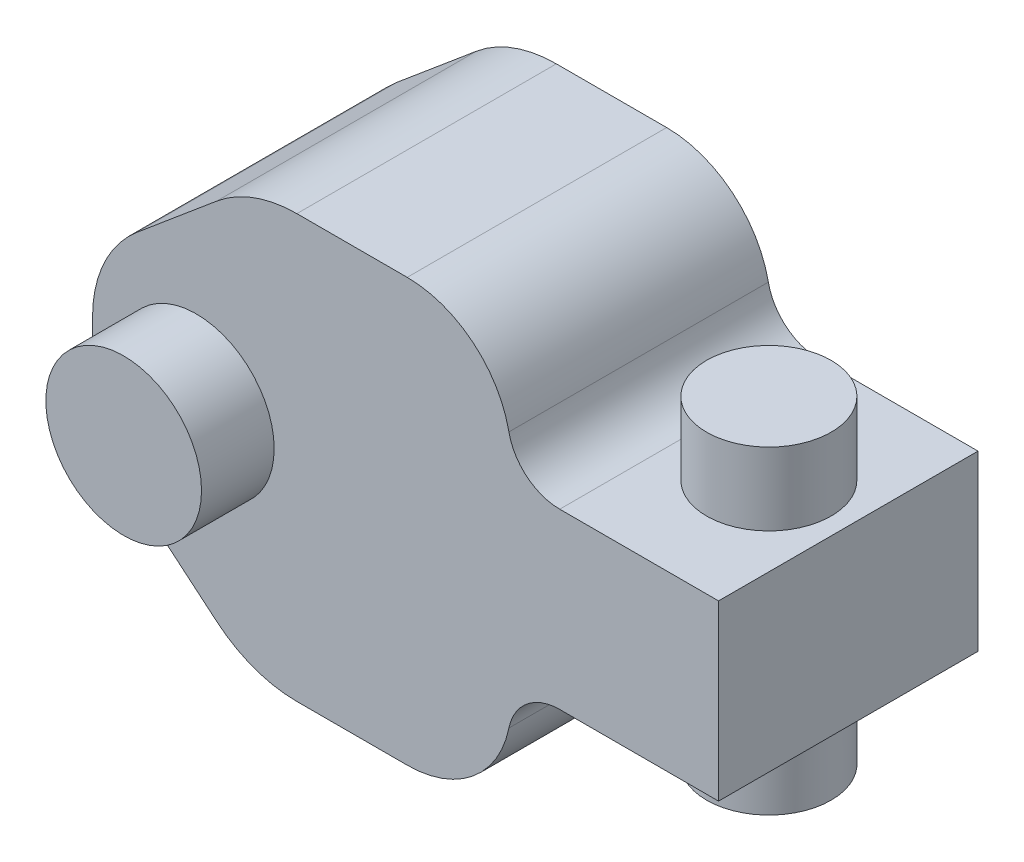
ISO-10303-21;
HEADER;
FILE_DESCRIPTION(('STEP AP214'),'2;1');
FILE_NAME('part.step','',(''),(''),'','','');
FILE_SCHEMA(('AUTOMOTIVE_DESIGN { 1 0 10303 214 1 1 1 1 }'));
ENDSEC;
DATA;
#1=APPLICATION_CONTEXT('core data for automotive mechanical design processes');
#2=APPLICATION_PROTOCOL_DEFINITION('international standard','automotive_design',2000,#1);
#3=PRODUCT_CONTEXT('',#1,'mechanical');
#4=PRODUCT('Part','Part','',(#3));
#5=PRODUCT_RELATED_PRODUCT_CATEGORY('part','',(#4));
#6=PRODUCT_DEFINITION_FORMATION('','',#4);
#7=PRODUCT_DEFINITION_CONTEXT('part definition',#1,'design');
#8=PRODUCT_DEFINITION('design','',#6,#7);
#9=PRODUCT_DEFINITION_SHAPE('','',#8);
#10=(LENGTH_UNIT() NAMED_UNIT(*) SI_UNIT(.MILLI.,.METRE.));
#11=(NAMED_UNIT(*) PLANE_ANGLE_UNIT() SI_UNIT($,.RADIAN.));
#12=(NAMED_UNIT(*) SI_UNIT($,.STERADIAN.) SOLID_ANGLE_UNIT());
#13=UNCERTAINTY_MEASURE_WITH_UNIT(LENGTH_MEASURE(1.E-05),#10,'distance_accuracy_value','');
#14=(GEOMETRIC_REPRESENTATION_CONTEXT(3) GLOBAL_UNCERTAINTY_ASSIGNED_CONTEXT((#13)) GLOBAL_UNIT_ASSIGNED_CONTEXT((#10,
#11,#12)) REPRESENTATION_CONTEXT('',''));
#15=CARTESIAN_POINT('',(0.,0.,0.));
#16=DIRECTION('',(0.,0.,1.));
#17=DIRECTION('',(1.,0.,0.));
#18=AXIS2_PLACEMENT_3D('',#15,#16,#17);
#19=CARTESIAN_POINT('',(4.14768016891706,-42.2907817969661,12.5));
#20=DIRECTION('',(-1.,0.,0.));
#21=DIRECTION('',(0.,0.,1.));
#22=AXIS2_PLACEMENT_3D('',#19,#20,#21);
#23=PLANE('',#22);
#24=DIRECTION('',(0.,1.,0.));
#25=VECTOR('',#24,1.);
#26=CARTESIAN_POINT('',(4.14768016891706,-42.2907817969661,12.5));
#27=LINE('',#26,#25);
#28=CARTESIAN_POINT('',(4.14768016891706,-30.2907817969661,12.5));
#29=VERTEX_POINT('',#28);
#30=CARTESIAN_POINT('',(4.14768016891707,-13.5792774095045,12.5));
#31=VERTEX_POINT('',#30);
#32=EDGE_CURVE('E178',#29,#31,#27,.T.);
#33=ORIENTED_EDGE('',*,*,#32,.F.);
#34=DIRECTION('',(0.,0.,1.));
#35=VECTOR('',#34,1.);
#36=CARTESIAN_POINT('',(4.14768016891706,-30.2907817969661,12.5));
#37=LINE('',#36,#35);
#38=CARTESIAN_POINT('',(4.14768016891707,-30.2907817969661,-12.5));
#39=VERTEX_POINT('',#38);
#40=EDGE_CURVE('E160',#39,#29,#37,.T.);
#41=ORIENTED_EDGE('',*,*,#40,.F.);
#42=DIRECTION('',(0.,1.,0.));
#43=VECTOR('',#42,1.);
#44=CARTESIAN_POINT('',(4.14768016891706,-42.2907817969661,-12.5));
#45=LINE('',#44,#43);
#46=CARTESIAN_POINT('',(4.14768016891706,-13.5792774095045,-12.5));
#47=VERTEX_POINT('',#46);
#48=EDGE_CURVE('E225',#39,#47,#45,.T.);
#49=ORIENTED_EDGE('',*,*,#48,.T.);
#50=DIRECTION('',(0.,0.,-1.));
#51=VECTOR('',#50,1.);
#52=CARTESIAN_POINT('',(4.14768016891707,-13.5792774095045,-12.5));
#53=LINE('',#52,#51);
#54=EDGE_CURVE('E184',#31,#47,#53,.T.);
#55=ORIENTED_EDGE('',*,*,#54,.F.);
#56=EDGE_LOOP('',(#33,#41,#49,#55));
#57=FACE_BOUND('',#56,.T.);
#58=ADVANCED_FACE('F45',(#57),#23,.F.);
#59=CARTESIAN_POINT('',(4.14768016891706,-1.57927740950448,12.5));
#60=DIRECTION('',(0.,-1.,0.));
#61=DIRECTION('',(1.,0.,0.));
#62=AXIS2_PLACEMENT_3D('',#59,#60,#61);
#63=PLANE('',#62);
#64=DIRECTION('',(-1.,0.,0.));
#65=VECTOR('',#64,1.);
#66=CARTESIAN_POINT('',(4.14768016891706,-1.57927740950448,12.5));
#67=LINE('',#66,#65);
#68=CARTESIAN_POINT('',(-25.8523198310829,-1.5792774095045,12.5));
#69=VERTEX_POINT('',#68);
#70=CARTESIAN_POINT('',(-36.4846770198885,-1.5792774095045,12.5));
#71=VERTEX_POINT('',#70);
#72=EDGE_CURVE('E186',#69,#71,#67,.T.);
#73=ORIENTED_EDGE('',*,*,#72,.F.);
#74=DIRECTION('',(0.,0.,1.));
#75=VECTOR('',#74,1.);
#76=CARTESIAN_POINT('',(-25.8523198310829,-1.5792774095045,12.5));
#77=LINE('',#76,#75);
#78=CARTESIAN_POINT('',(-25.8523198310829,-1.5792774095045,-12.5));
#79=VERTEX_POINT('',#78);
#80=EDGE_CURVE('E292',#69,#79,#77,.F.);
#81=ORIENTED_EDGE('',*,*,#80,.T.);
#82=DIRECTION('',(-1.,0.,0.));
#83=VECTOR('',#82,1.);
#84=CARTESIAN_POINT('',(4.14768016891706,-1.57927740950448,-12.5));
#85=LINE('',#84,#83);
#86=CARTESIAN_POINT('',(-36.4846770198885,-1.5792774095045,-12.5));
#87=VERTEX_POINT('',#86);
#88=EDGE_CURVE('E228',#79,#87,#85,.T.);
#89=ORIENTED_EDGE('',*,*,#88,.T.);
#90=DIRECTION('',(0.,0.,-1.));
#91=VECTOR('',#90,1.);
#92=CARTESIAN_POINT('',(-36.4846770198885,-1.5792774095045,12.5));
#93=LINE('',#92,#91);
#94=EDGE_CURVE('E278',#71,#87,#93,.T.);
#95=ORIENTED_EDGE('',*,*,#94,.F.);
#96=EDGE_LOOP('',(#73,#81,#89,#95));
#97=FACE_BOUND('',#96,.T.);
#98=ADVANCED_FACE('F348',(#97),#63,.F.);
#99=CARTESIAN_POINT('',(-36.4846770198885,-13.5792774095045,12.5));
#100=DIRECTION('',(0.,0.,-1.));
#101=DIRECTION('',(-1.,0.,0.));
#102=AXIS2_PLACEMENT_3D('',#99,#100,#101);
#103=CYLINDRICAL_SURFACE('',#102,12.);
#104=CARTESIAN_POINT('',(-36.4846770198885,-13.5792774095045,-12.5));
#105=DIRECTION('',(0.,0.,1.));
#106=DIRECTION('',(1.,0.,0.));
#107=AXIS2_PLACEMENT_3D('',#104,#105,#106);
#108=CIRCLE('',#107,12.);
#109=CARTESIAN_POINT('',(-44.198128336127,-4.3867440920768,-12.5));
#110=VERTEX_POINT('',#109);
#111=EDGE_CURVE('E231',#87,#110,#108,.T.);
#112=ORIENTED_EDGE('',*,*,#111,.T.);
#113=DIRECTION('',(0.,0.,-1.));
#114=VECTOR('',#113,1.);
#115=CARTESIAN_POINT('',(-44.198128336127,-4.3867440920768,12.5));
#116=LINE('',#115,#114);
#117=CARTESIAN_POINT('',(-44.198128336127,-4.3867440920768,12.5));
#118=VERTEX_POINT('',#117);
#119=EDGE_CURVE('E274',#118,#110,#116,.T.);
#120=ORIENTED_EDGE('',*,*,#119,.F.);
#121=CARTESIAN_POINT('',(-36.4846770198885,-13.5792774095045,12.5));
#122=DIRECTION('',(0.,0.,1.));
#123=DIRECTION('',(1.,0.,0.));
#124=AXIS2_PLACEMENT_3D('',#121,#122,#123);
#125=CIRCLE('',#124,12.);
#126=EDGE_CURVE('E191',#71,#118,#125,.T.);
#127=ORIENTED_EDGE('',*,*,#126,.F.);
#128=ORIENTED_EDGE('',*,*,#94,.T.);
#129=EDGE_LOOP('',(#112,#120,#127,#128));
#130=FACE_BOUND('',#129,.T.);
#131=ADVANCED_FACE('F355',(#130),#103,.T.);
#132=CARTESIAN_POINT('',(-44.198128336127,-4.3867440920768,12.5));
#133=DIRECTION('',(0.64278760968654,-0.766044443118978,0.));
#134=DIRECTION('',(0.766044443118978,0.64278760968654,0.));
#135=AXIS2_PLACEMENT_3D('',#132,#133,#134);
#136=PLANE('',#135);
#137=DIRECTION('',(-0.766044443118978,-0.64278760968654,0.));
#138=VECTOR('',#137,1.);
#139=CARTESIAN_POINT('',(-44.198128336127,-4.3867440920768,-12.5));
#140=LINE('',#139,#138);
#141=CARTESIAN_POINT('',(-51.8866600097009,-10.8381881836675,-12.5));
#142=VERTEX_POINT('',#141);
#143=EDGE_CURVE('E234',#110,#142,#140,.T.);
#144=ORIENTED_EDGE('',*,*,#143,.T.);
#145=DIRECTION('',(0.,0.,-1.));
#146=VECTOR('',#145,1.);
#147=CARTESIAN_POINT('',(-51.8866600097009,-10.8381881836675,12.5));
#148=LINE('',#147,#146);
#149=CARTESIAN_POINT('',(-51.8866600097009,-10.8381881836675,12.5));
#150=VERTEX_POINT('',#149);
#151=EDGE_CURVE('E270',#150,#142,#148,.T.);
#152=ORIENTED_EDGE('',*,*,#151,.F.);
#153=DIRECTION('',(-0.766044443118978,-0.64278760968654,0.));
#154=VECTOR('',#153,1.);
#155=CARTESIAN_POINT('',(-44.198128336127,-4.3867440920768,12.5));
#156=LINE('',#155,#154);
#157=EDGE_CURVE('E202',#118,#150,#156,.T.);
#158=ORIENTED_EDGE('',*,*,#157,.F.);
#159=ORIENTED_EDGE('',*,*,#119,.T.);
#160=EDGE_LOOP('',(#144,#152,#158,#159));
#161=FACE_BOUND('',#160,.T.);
#162=ADVANCED_FACE('F359',(#161),#136,.F.);
#163=CARTESIAN_POINT('',(-44.1732086934625,-20.0307215010953,12.5));
#164=DIRECTION('',(0.,0.,-1.));
#165=DIRECTION('',(-1.,0.,0.));
#166=AXIS2_PLACEMENT_3D('',#163,#164,#165);
#167=CYLINDRICAL_SURFACE('',#166,12.);
#168=CARTESIAN_POINT('',(-44.1732086934625,-20.0307215010953,-12.5));
#169=DIRECTION('',(0.,0.,1.));
#170=DIRECTION('',(1.,0.,0.));
#171=AXIS2_PLACEMENT_3D('',#168,#169,#170);
#172=CIRCLE('',#171,12.);
#173=CARTESIAN_POINT('',(-56.1732086934625,-20.0307215010953,-12.5));
#174=VERTEX_POINT('',#173);
#175=EDGE_CURVE('E237',#142,#174,#172,.T.);
#176=ORIENTED_EDGE('',*,*,#175,.T.);
#177=DIRECTION('',(0.,0.,-1.));
#178=VECTOR('',#177,1.);
#179=CARTESIAN_POINT('',(-56.1732086934625,-20.0307215010953,12.5));
#180=LINE('',#179,#178);
#181=CARTESIAN_POINT('',(-56.1732086934625,-20.0307215010953,12.5));
#182=VERTEX_POINT('',#181);
#183=EDGE_CURVE('E266',#182,#174,#180,.T.);
#184=ORIENTED_EDGE('',*,*,#183,.F.);
#185=CARTESIAN_POINT('',(-44.1732086934625,-20.0307215010953,12.5));
#186=DIRECTION('',(0.,0.,1.));
#187=DIRECTION('',(1.,0.,0.));
#188=AXIS2_PLACEMENT_3D('',#185,#186,#187);
#189=CIRCLE('',#188,12.);
#190=EDGE_CURVE('E205',#150,#182,#189,.T.);
#191=ORIENTED_EDGE('',*,*,#190,.F.);
#192=ORIENTED_EDGE('',*,*,#151,.T.);
#193=EDGE_LOOP('',(#176,#184,#191,#192));
#194=FACE_BOUND('',#193,.T.);
#195=ADVANCED_FACE('F366',(#194),#167,.T.);
#196=CARTESIAN_POINT('',(-56.1732086934625,-20.0307215010953,12.5));
#197=DIRECTION('',(1.,0.,0.));
#198=DIRECTION('',(0.,0.,-1.));
#199=AXIS2_PLACEMENT_3D('',#196,#197,#198);
#200=PLANE('',#199);
#201=DIRECTION('',(0.,-1.,0.));
#202=VECTOR('',#201,1.);
#203=CARTESIAN_POINT('',(-56.1732086934625,-20.0307215010953,-12.5));
#204=LINE('',#203,#202);
#205=CARTESIAN_POINT('',(-56.1732086934625,-23.8393377053753,-12.5));
#206=VERTEX_POINT('',#205);
#207=EDGE_CURVE('E240',#174,#206,#204,.T.);
#208=ORIENTED_EDGE('',*,*,#207,.T.);
#209=DIRECTION('',(0.,0.,-1.));
#210=VECTOR('',#209,1.);
#211=CARTESIAN_POINT('',(-56.1732086934625,-23.8393377053753,12.5));
#212=LINE('',#211,#210);
#213=CARTESIAN_POINT('',(-56.1732086934625,-23.8393377053753,12.5));
#214=VERTEX_POINT('',#213);
#215=EDGE_CURVE('E262',#214,#206,#212,.T.);
#216=ORIENTED_EDGE('',*,*,#215,.F.);
#217=DIRECTION('',(0.,-1.,0.));
#218=VECTOR('',#217,1.);
#219=CARTESIAN_POINT('',(-56.1732086934625,-20.0307215010953,12.5));
#220=LINE('',#219,#218);
#221=EDGE_CURVE('E208',#182,#214,#220,.T.);
#222=ORIENTED_EDGE('',*,*,#221,.F.);
#223=ORIENTED_EDGE('',*,*,#183,.T.);
#224=EDGE_LOOP('',(#208,#216,#222,#223));
#225=FACE_BOUND('',#224,.T.);
#226=ADVANCED_FACE('F369',(#225),#200,.F.);
#227=CARTESIAN_POINT('',(-44.1732086934625,-23.8393377053753,12.5));
#228=DIRECTION('',(0.,0.,-1.));
#229=DIRECTION('',(-1.,0.,0.));
#230=AXIS2_PLACEMENT_3D('',#227,#228,#229);
#231=CYLINDRICAL_SURFACE('',#230,12.);
#232=CARTESIAN_POINT('',(-44.1732086934625,-23.8393377053753,-12.5));
#233=DIRECTION('',(0.,0.,1.));
#234=DIRECTION('',(1.,0.,0.));
#235=AXIS2_PLACEMENT_3D('',#232,#233,#234);
#236=CIRCLE('',#235,12.);
#237=CARTESIAN_POINT('',(-51.8866600097009,-33.0318710228031,-12.5));
#238=VERTEX_POINT('',#237);
#239=EDGE_CURVE('E243',#206,#238,#236,.T.);
#240=ORIENTED_EDGE('',*,*,#239,.T.);
#241=DIRECTION('',(0.,0.,-1.));
#242=VECTOR('',#241,1.);
#243=CARTESIAN_POINT('',(-51.8866600097009,-33.0318710228031,12.5));
#244=LINE('',#243,#242);
#245=CARTESIAN_POINT('',(-51.8866600097009,-33.0318710228031,12.5));
#246=VERTEX_POINT('',#245);
#247=EDGE_CURVE('E258',#246,#238,#244,.T.);
#248=ORIENTED_EDGE('',*,*,#247,.F.);
#249=CARTESIAN_POINT('',(-44.1732086934625,-23.8393377053753,12.5));
#250=DIRECTION('',(0.,0.,1.));
#251=DIRECTION('',(1.,0.,0.));
#252=AXIS2_PLACEMENT_3D('',#249,#250,#251);
#253=CIRCLE('',#252,12.);
#254=EDGE_CURVE('E211',#214,#246,#253,.T.);
#255=ORIENTED_EDGE('',*,*,#254,.F.);
#256=ORIENTED_EDGE('',*,*,#215,.T.);
#257=EDGE_LOOP('',(#240,#248,#255,#256));
#258=FACE_BOUND('',#257,.T.);
#259=ADVANCED_FACE('F374',(#258),#231,.T.);
#260=CARTESIAN_POINT('',(-51.8866600097009,-33.0318710228031,12.5));
#261=DIRECTION('',(0.642787609686541,0.766044443118977,0.));
#262=DIRECTION('',(-0.766044443118977,0.642787609686541,0.));
#263=AXIS2_PLACEMENT_3D('',#260,#261,#262);
#264=PLANE('',#263);
#265=DIRECTION('',(0.766044443118976,-0.642787609686541,0.));
#266=VECTOR('',#265,1.);
#267=CARTESIAN_POINT('',(-51.8866600097009,-33.0318710228031,-12.5));
#268=LINE('',#267,#266);
#269=CARTESIAN_POINT('',(-44.198128336127,-39.4833151143938,-12.5));
#270=VERTEX_POINT('',#269);
#271=EDGE_CURVE('E246',#238,#270,#268,.T.);
#272=ORIENTED_EDGE('',*,*,#271,.T.);
#273=DIRECTION('',(0.,0.,-1.));
#274=VECTOR('',#273,1.);
#275=CARTESIAN_POINT('',(-44.198128336127,-39.4833151143938,12.5));
#276=LINE('',#275,#274);
#277=CARTESIAN_POINT('',(-44.198128336127,-39.4833151143938,12.5));
#278=VERTEX_POINT('',#277);
#279=EDGE_CURVE('E254',#278,#270,#276,.T.);
#280=ORIENTED_EDGE('',*,*,#279,.F.);
#281=DIRECTION('',(0.766044443118976,-0.642787609686541,0.));
#282=VECTOR('',#281,1.);
#283=CARTESIAN_POINT('',(-51.8866600097009,-33.0318710228031,12.5));
#284=LINE('',#283,#282);
#285=EDGE_CURVE('E214',#246,#278,#284,.T.);
#286=ORIENTED_EDGE('',*,*,#285,.F.);
#287=ORIENTED_EDGE('',*,*,#247,.T.);
#288=EDGE_LOOP('',(#272,#280,#286,#287));
#289=FACE_BOUND('',#288,.T.);
#290=ADVANCED_FACE('F380',(#289),#264,.F.);
#291=CARTESIAN_POINT('',(-36.4846770198885,-30.2907817969661,12.5));
#292=DIRECTION('',(0.,0.,-1.));
#293=DIRECTION('',(-1.,0.,0.));
#294=AXIS2_PLACEMENT_3D('',#291,#292,#293);
#295=CYLINDRICAL_SURFACE('',#294,12.);
#296=CARTESIAN_POINT('',(-36.4846770198885,-30.2907817969661,-12.5));
#297=DIRECTION('',(0.,0.,1.));
#298=DIRECTION('',(1.,0.,0.));
#299=AXIS2_PLACEMENT_3D('',#296,#297,#298);
#300=CIRCLE('',#299,12.);
#301=CARTESIAN_POINT('',(-36.4846770198885,-42.2907817969661,-12.5));
#302=VERTEX_POINT('',#301);
#303=EDGE_CURVE('E194',#270,#302,#300,.T.);
#304=ORIENTED_EDGE('',*,*,#303,.T.);
#305=DIRECTION('',(0.,0.,-1.));
#306=VECTOR('',#305,1.);
#307=CARTESIAN_POINT('',(-36.4846770198885,-42.2907817969661,12.5));
#308=LINE('',#307,#306);
#309=CARTESIAN_POINT('',(-36.4846770198885,-42.2907817969661,12.5));
#310=VERTEX_POINT('',#309);
#311=EDGE_CURVE('E224',#310,#302,#308,.T.);
#312=ORIENTED_EDGE('',*,*,#311,.F.);
#313=CARTESIAN_POINT('',(-36.4846770198885,-30.2907817969661,12.5));
#314=DIRECTION('',(0.,0.,1.));
#315=DIRECTION('',(1.,0.,0.));
#316=AXIS2_PLACEMENT_3D('',#313,#314,#315);
#317=CIRCLE('',#316,12.);
#318=EDGE_CURVE('E217',#278,#310,#317,.T.);
#319=ORIENTED_EDGE('',*,*,#318,.F.);
#320=ORIENTED_EDGE('',*,*,#279,.T.);
#321=EDGE_LOOP('',(#304,#312,#319,#320));
#322=FACE_BOUND('',#321,.T.);
#323=ADVANCED_FACE('F384',(#322),#295,.T.);
#324=CARTESIAN_POINT('',(-36.4846770198885,-42.2907817969661,12.5));
#325=DIRECTION('',(0.,1.,0.));
#326=DIRECTION('',(0.,0.,1.));
#327=AXIS2_PLACEMENT_3D('',#324,#325,#326);
#328=PLANE('',#327);
#329=DIRECTION('',(1.,0.,0.));
#330=VECTOR('',#329,1.);
#331=CARTESIAN_POINT('',(-36.4846770198885,-42.2907817969661,-12.5));
#332=LINE('',#331,#330);
#333=CARTESIAN_POINT('',(-25.8523198310829,-42.2907817969661,-12.5));
#334=VERTEX_POINT('',#333);
#335=EDGE_CURVE('E187',#302,#334,#332,.T.);
#336=ORIENTED_EDGE('',*,*,#335,.T.);
#337=DIRECTION('',(0.,0.,-1.));
#338=VECTOR('',#337,1.);
#339=CARTESIAN_POINT('',(-25.8523198310829,-42.2907817969661,12.5));
#340=LINE('',#339,#338);
#341=CARTESIAN_POINT('',(-25.8523198310829,-42.2907817969661,12.5));
#342=VERTEX_POINT('',#341);
#343=EDGE_CURVE('E302',#334,#342,#340,.F.);
#344=ORIENTED_EDGE('',*,*,#343,.T.);
#345=DIRECTION('',(1.,0.,0.));
#346=VECTOR('',#345,1.);
#347=CARTESIAN_POINT('',(-36.4846770198885,-42.2907817969661,12.5));
#348=LINE('',#347,#346);
#349=EDGE_CURVE('E220',#310,#342,#348,.T.);
#350=ORIENTED_EDGE('',*,*,#349,.F.);
#351=ORIENTED_EDGE('',*,*,#311,.T.);
#352=EDGE_LOOP('',(#336,#344,#350,#351));
#353=FACE_BOUND('',#352,.T.);
#354=ADVANCED_FACE('F388',(#353),#328,.F.);
#355=CARTESIAN_POINT('',(-36.4846770198885,-13.5792774095045,12.5));
#356=DIRECTION('',(0.,0.,1.));
#357=DIRECTION('',(1.,0.,0.));
#358=AXIS2_PLACEMENT_3D('',#355,#356,#357);
#359=PLANE('',#358);
#360=DIRECTION('',(1.,0.,0.));
#361=VECTOR('',#360,1.);
#362=CARTESIAN_POINT('',(-15.8523198310829,-13.5792774095045,12.5));
#363=LINE('',#362,#361);
#364=CARTESIAN_POINT('',(-11.1553813743839,-13.5792774095045,12.5));
#365=VERTEX_POINT('',#364);
#366=EDGE_CURVE('E343',#365,#31,#363,.T.);
#367=ORIENTED_EDGE('',*,*,#366,.F.);
#368=CARTESIAN_POINT('',(-11.1553813743839,-8.57927740950449,12.5));
#369=DIRECTION('',(0.,0.,1.));
#370=DIRECTION('',(1.,0.,0.));
#371=AXIS2_PLACEMENT_3D('',#368,#369,#370);
#372=CIRCLE('',#371,5.);
#373=CARTESIAN_POINT('',(-16.0543608599502,-9.57927740950449,12.5));
#374=VERTEX_POINT('',#373);
#375=EDGE_CURVE('E317',#365,#374,#372,.F.);
#376=ORIENTED_EDGE('',*,*,#375,.T.);
#377=CARTESIAN_POINT('',(-25.8523198310829,-11.5792774095045,12.5));
#378=DIRECTION('',(0.,0.,1.));
#379=DIRECTION('',(1.,0.,0.));
#380=AXIS2_PLACEMENT_3D('',#377,#378,#379);
#381=CIRCLE('',#380,10.);
#382=EDGE_CURVE('E289',#374,#69,#381,.T.);
#383=ORIENTED_EDGE('',*,*,#382,.T.);
#384=ORIENTED_EDGE('',*,*,#72,.T.);
#385=ORIENTED_EDGE('',*,*,#126,.T.);
#386=ORIENTED_EDGE('',*,*,#157,.T.);
#387=ORIENTED_EDGE('',*,*,#190,.T.);
#388=ORIENTED_EDGE('',*,*,#221,.T.);
#389=ORIENTED_EDGE('',*,*,#254,.T.);
#390=ORIENTED_EDGE('',*,*,#285,.T.);
#391=ORIENTED_EDGE('',*,*,#318,.T.);
#392=ORIENTED_EDGE('',*,*,#349,.T.);
#393=CARTESIAN_POINT('',(-25.8523198310829,-32.2907817969661,12.5));
#394=DIRECTION('',(0.,0.,1.));
#395=DIRECTION('',(1.,0.,0.));
#396=AXIS2_PLACEMENT_3D('',#393,#394,#395);
#397=CIRCLE('',#396,10.);
#398=CARTESIAN_POINT('',(-16.0543608599502,-34.2907817969661,12.5));
#399=VERTEX_POINT('',#398);
#400=EDGE_CURVE('E286',#342,#399,#397,.T.);
#401=ORIENTED_EDGE('',*,*,#400,.T.);
#402=CARTESIAN_POINT('',(-11.1553813743839,-35.2907817969661,12.5));
#403=DIRECTION('',(0.,0.,1.));
#404=DIRECTION('',(1.,0.,0.));
#405=AXIS2_PLACEMENT_3D('',#402,#403,#404);
#406=CIRCLE('',#405,5.);
#407=CARTESIAN_POINT('',(-11.1553813743839,-30.2907817969661,12.5));
#408=VERTEX_POINT('',#407);
#409=EDGE_CURVE('E54',#399,#408,#406,.F.);
#410=ORIENTED_EDGE('',*,*,#409,.T.);
#411=DIRECTION('',(-1.,0.,0.));
#412=VECTOR('',#411,1.);
#413=CARTESIAN_POINT('',(4.14768016891706,-30.2907817969661,12.5));
#414=LINE('',#413,#412);
#415=EDGE_CURVE('E164',#29,#408,#414,.T.);
#416=ORIENTED_EDGE('',*,*,#415,.F.);
#417=ORIENTED_EDGE('',*,*,#32,.T.);
#418=EDGE_LOOP('',(#367,#376,#383,#384,#385,#386,#387,#388,#389,#390,#391,#392,#401,#410,#416,#417));
#419=FACE_BOUND('',#418,.T.);
#420=CARTESIAN_POINT('',(-46.1732086934625,-22.2907817969661,12.5));
#421=DIRECTION('',(0.,0.,1.));
#422=DIRECTION('',(1.,0.,0.));
#423=AXIS2_PLACEMENT_3D('',#420,#421,#422);
#424=CIRCLE('',#423,7.5);
#425=CARTESIAN_POINT('',(-38.6732086934625,-22.2907817969661,12.5));
#426=VERTEX_POINT('',#425);
#427=EDGE_CURVE('E197',#426,#426,#424,.F.);
#428=ORIENTED_EDGE('',*,*,#427,.T.);
#429=EDGE_LOOP('',(#428));
#430=FACE_BOUND('',#429,.T.);
#431=ADVANCED_FACE('F176',(#419,#430),#359,.T.);
#432=CARTESIAN_POINT('',(-36.4846770198885,-13.5792774095045,-12.5));
#433=DIRECTION('',(0.,0.,1.));
#434=DIRECTION('',(1.,0.,0.));
#435=AXIS2_PLACEMENT_3D('',#432,#433,#434);
#436=PLANE('',#435);
#437=CARTESIAN_POINT('',(-46.1732086934625,-22.2907817969661,-12.5));
#438=DIRECTION('',(0.,0.,1.));
#439=DIRECTION('',(1.,0.,0.));
#440=AXIS2_PLACEMENT_3D('',#437,#438,#439);
#441=CIRCLE('',#440,7.5);
#442=CARTESIAN_POINT('',(-38.6732086934625,-22.2907817969661,-12.5));
#443=VERTEX_POINT('',#442);
#444=EDGE_CURVE('E282',#443,#443,#441,.F.);
#445=ORIENTED_EDGE('',*,*,#444,.F.);
#446=EDGE_LOOP('',(#445));
#447=FACE_BOUND('',#446,.T.);
#448=ORIENTED_EDGE('',*,*,#88,.F.);
#449=CARTESIAN_POINT('',(-25.8523198310829,-11.5792774095045,-12.5));
#450=DIRECTION('',(0.,0.,1.));
#451=DIRECTION('',(1.,0.,0.));
#452=AXIS2_PLACEMENT_3D('',#449,#450,#451);
#453=CIRCLE('',#452,10.);
#454=CARTESIAN_POINT('',(-16.0543608599502,-9.57927740950449,-12.5));
#455=VERTEX_POINT('',#454);
#456=EDGE_CURVE('E298',#79,#455,#453,.F.);
#457=ORIENTED_EDGE('',*,*,#456,.T.);
#458=CARTESIAN_POINT('',(-11.1553813743839,-8.57927740950449,-12.5));
#459=DIRECTION('',(0.,0.,1.));
#460=DIRECTION('',(1.,0.,0.));
#461=AXIS2_PLACEMENT_3D('',#458,#459,#460);
#462=CIRCLE('',#461,5.);
#463=CARTESIAN_POINT('',(-11.1553813743839,-13.5792774095045,-12.5));
#464=VERTEX_POINT('',#463);
#465=EDGE_CURVE('E320',#455,#464,#462,.T.);
#466=ORIENTED_EDGE('',*,*,#465,.T.);
#467=DIRECTION('',(-1.,0.,0.));
#468=VECTOR('',#467,1.);
#469=CARTESIAN_POINT('',(-15.8523198310829,-13.5792774095045,-12.5));
#470=LINE('',#469,#468);
#471=EDGE_CURVE('E330',#47,#464,#470,.T.);
#472=ORIENTED_EDGE('',*,*,#471,.F.);
#473=ORIENTED_EDGE('',*,*,#48,.F.);
#474=DIRECTION('',(1.,0.,0.));
#475=VECTOR('',#474,1.);
#476=CARTESIAN_POINT('',(4.14768016891707,-30.2907817969661,-12.5));
#477=LINE('',#476,#475);
#478=CARTESIAN_POINT('',(-11.1553813743839,-30.2907817969661,-12.5));
#479=VERTEX_POINT('',#478);
#480=EDGE_CURVE('E166',#479,#39,#477,.T.);
#481=ORIENTED_EDGE('',*,*,#480,.F.);
#482=CARTESIAN_POINT('',(-11.1553813743839,-35.2907817969661,-12.5));
#483=DIRECTION('',(0.,0.,1.));
#484=DIRECTION('',(1.,0.,0.));
#485=AXIS2_PLACEMENT_3D('',#482,#483,#484);
#486=CIRCLE('',#485,5.);
#487=CARTESIAN_POINT('',(-16.0543608599502,-34.2907817969661,-12.5));
#488=VERTEX_POINT('',#487);
#489=EDGE_CURVE('E61',#479,#488,#486,.T.);
#490=ORIENTED_EDGE('',*,*,#489,.T.);
#491=CARTESIAN_POINT('',(-25.8523198310829,-32.2907817969661,-12.5));
#492=DIRECTION('',(0.,0.,1.));
#493=DIRECTION('',(1.,0.,0.));
#494=AXIS2_PLACEMENT_3D('',#491,#492,#493);
#495=CIRCLE('',#494,10.);
#496=EDGE_CURVE('E295',#488,#334,#495,.F.);
#497=ORIENTED_EDGE('',*,*,#496,.T.);
#498=ORIENTED_EDGE('',*,*,#335,.F.);
#499=ORIENTED_EDGE('',*,*,#303,.F.);
#500=ORIENTED_EDGE('',*,*,#271,.F.);
#501=ORIENTED_EDGE('',*,*,#239,.F.);
#502=ORIENTED_EDGE('',*,*,#207,.F.);
#503=ORIENTED_EDGE('',*,*,#175,.F.);
#504=ORIENTED_EDGE('',*,*,#143,.F.);
#505=ORIENTED_EDGE('',*,*,#111,.F.);
#506=EDGE_LOOP('',(#448,#457,#466,#472,#473,#481,#490,#497,#498,#499,#500,#501,#502,#503,#504,#505));
#507=FACE_BOUND('',#506,.T.);
#508=ADVANCED_FACE('F329',(#447,#507),#436,.F.);
#509=CARTESIAN_POINT('',(-46.1732086934625,-22.2907817969661,-19.5));
#510=DIRECTION('',(0.,0.,1.));
#511=DIRECTION('',(1.,0.,0.));
#512=AXIS2_PLACEMENT_3D('',#509,#510,#511);
#513=PLANE('',#512);
#514=CARTESIAN_POINT('',(-46.1732086934625,-22.2907817969661,-19.5));
#515=DIRECTION('',(0.,0.,1.));
#516=DIRECTION('',(1.,0.,0.));
#517=AXIS2_PLACEMENT_3D('',#514,#515,#516);
#518=CIRCLE('',#517,7.5);
#519=CARTESIAN_POINT('',(-38.6732086934625,-22.2907817969661,-19.5));
#520=VERTEX_POINT('',#519);
#521=EDGE_CURVE('E338',#520,#520,#518,.T.);
#522=ORIENTED_EDGE('',*,*,#521,.F.);
#523=EDGE_LOOP('',(#522));
#524=FACE_BOUND('',#523,.T.);
#525=ADVANCED_FACE('F409',(#524),#513,.F.);
#526=CARTESIAN_POINT('',(-46.1732086934625,-22.2907817969661,19.5));
#527=DIRECTION('',(0.,0.,-1.));
#528=DIRECTION('',(-1.,0.,0.));
#529=AXIS2_PLACEMENT_3D('',#526,#527,#528);
#530=CYLINDRICAL_SURFACE('',#529,7.5);
#531=ORIENTED_EDGE('',*,*,#521,.T.);
#532=EDGE_LOOP('',(#531));
#533=FACE_BOUND('',#532,.T.);
#534=ORIENTED_EDGE('',*,*,#444,.T.);
#535=EDGE_LOOP('',(#534));
#536=FACE_BOUND('',#535,.T.);
#537=ADVANCED_FACE('F406',(#533,#536),#530,.T.);
#538=ORIENTED_EDGE('',*,*,#427,.F.);
#539=EDGE_LOOP('',(#538));
#540=FACE_BOUND('',#539,.T.);
#541=CARTESIAN_POINT('',(-46.1732086934625,-22.2907817969661,19.5));
#542=DIRECTION('',(0.,0.,1.));
#543=DIRECTION('',(1.,0.,0.));
#544=AXIS2_PLACEMENT_3D('',#541,#542,#543);
#545=CIRCLE('',#544,7.5);
#546=CARTESIAN_POINT('',(-38.6732086934625,-22.2907817969661,19.5));
#547=VERTEX_POINT('',#546);
#548=EDGE_CURVE('E399',#547,#547,#545,.T.);
#549=ORIENTED_EDGE('',*,*,#548,.F.);
#550=EDGE_LOOP('',(#549));
#551=FACE_BOUND('',#550,.T.);
#552=ADVANCED_FACE('F416',(#540,#551),#530,.T.);
#553=CARTESIAN_POINT('',(-46.1732086934625,-22.2907817969661,19.5));
#554=DIRECTION('',(0.,0.,1.));
#555=DIRECTION('',(1.,0.,0.));
#556=AXIS2_PLACEMENT_3D('',#553,#554,#555);
#557=PLANE('',#556);
#558=ORIENTED_EDGE('',*,*,#548,.T.);
#559=EDGE_LOOP('',(#558));
#560=FACE_BOUND('',#559,.T.);
#561=ADVANCED_FACE('F459',(#560),#557,.T.);
#562=CARTESIAN_POINT('',(0.,-13.5792774095045,0.));
#563=DIRECTION('',(0.,1.,0.));
#564=DIRECTION('',(-1.,0.,0.));
#565=AXIS2_PLACEMENT_3D('',#562,#563,#564);
#566=PLANE('',#565);
#567=CARTESIAN_POINT('',(-3.50231983108293,-13.5792774095045,0.));
#568=DIRECTION('',(0.,1.,0.));
#569=DIRECTION('',(-1.,0.,0.));
#570=AXIS2_PLACEMENT_3D('',#567,#568,#569);
#571=CIRCLE('',#570,6.);
#572=CARTESIAN_POINT('',(-9.50231983108293,-13.5792774095045,0.));
#573=VERTEX_POINT('',#572);
#574=EDGE_CURVE('E628',#573,#573,#571,.T.);
#575=ORIENTED_EDGE('',*,*,#574,.F.);
#576=EDGE_LOOP('',(#575));
#577=FACE_BOUND('',#576,.T.);
#578=ORIENTED_EDGE('',*,*,#471,.T.);
#579=DIRECTION('',(0.,0.,-1.));
#580=VECTOR('',#579,1.);
#581=CARTESIAN_POINT('',(-11.1553813743839,-13.5792774095045,12.5));
#582=LINE('',#581,#580);
#583=EDGE_CURVE('E305',#464,#365,#582,.F.);
#584=ORIENTED_EDGE('',*,*,#583,.T.);
#585=ORIENTED_EDGE('',*,*,#366,.T.);
#586=ORIENTED_EDGE('',*,*,#54,.T.);
#587=EDGE_LOOP('',(#578,#584,#585,#586));
#588=FACE_BOUND('',#587,.T.);
#589=ADVANCED_FACE('F336',(#577,#588),#566,.T.);
#590=CARTESIAN_POINT('',(0.,-30.2907817969661,0.));
#591=DIRECTION('',(0.,1.,0.));
#592=DIRECTION('',(0.,0.,1.));
#593=AXIS2_PLACEMENT_3D('',#590,#591,#592);
#594=PLANE('',#593);
#595=CARTESIAN_POINT('',(-3.50231983108294,-30.2907817969661,0.));
#596=DIRECTION('',(0.,1.,0.));
#597=DIRECTION('',(0.,0.,1.));
#598=AXIS2_PLACEMENT_3D('',#595,#596,#597);
#599=CIRCLE('',#598,6.);
#600=CARTESIAN_POINT('',(-3.50231983108294,-30.2907817969661,6.));
#601=VERTEX_POINT('',#600);
#602=EDGE_CURVE('E11',#601,#601,#599,.F.);
#603=ORIENTED_EDGE('',*,*,#602,.F.);
#604=EDGE_LOOP('',(#603));
#605=FACE_BOUND('',#604,.T.);
#606=ORIENTED_EDGE('',*,*,#415,.T.);
#607=DIRECTION('',(0.,0.,-1.));
#608=VECTOR('',#607,1.);
#609=CARTESIAN_POINT('',(-11.1553813743839,-30.2907817969661,0.));
#610=LINE('',#609,#608);
#611=EDGE_CURVE('E312',#408,#479,#610,.T.);
#612=ORIENTED_EDGE('',*,*,#611,.T.);
#613=ORIENTED_EDGE('',*,*,#480,.T.);
#614=ORIENTED_EDGE('',*,*,#40,.T.);
#615=EDGE_LOOP('',(#606,#612,#613,#614));
#616=FACE_BOUND('',#615,.T.);
#617=ADVANCED_FACE('F162',(#605,#616),#594,.F.);
#618=CARTESIAN_POINT('',(-25.8523198310829,-11.5792774095045,-12.5));
#619=DIRECTION('',(0.,0.,1.));
#620=DIRECTION('',(1.,0.,0.));
#621=AXIS2_PLACEMENT_3D('',#618,#619,#620);
#622=CYLINDRICAL_SURFACE('',#621,10.);
#623=ORIENTED_EDGE('',*,*,#382,.F.);
#624=DIRECTION('',(0.,0.,1.));
#625=VECTOR('',#624,1.);
#626=CARTESIAN_POINT('',(-16.0543608599502,-9.57927740950449,-12.5));
#627=LINE('',#626,#625);
#628=EDGE_CURVE('E309',#374,#455,#627,.F.);
#629=ORIENTED_EDGE('',*,*,#628,.T.);
#630=ORIENTED_EDGE('',*,*,#456,.F.);
#631=ORIENTED_EDGE('',*,*,#80,.F.);
#632=EDGE_LOOP('',(#623,#629,#630,#631));
#633=FACE_BOUND('',#632,.T.);
#634=ADVANCED_FACE('F346',(#633),#622,.T.);
#635=CARTESIAN_POINT('',(-25.8523198310829,-32.2907817969661,12.5));
#636=DIRECTION('',(0.,0.,-1.));
#637=DIRECTION('',(-1.,0.,0.));
#638=AXIS2_PLACEMENT_3D('',#635,#636,#637);
#639=CYLINDRICAL_SURFACE('',#638,10.);
#640=ORIENTED_EDGE('',*,*,#496,.F.);
#641=DIRECTION('',(0.,0.,-1.));
#642=VECTOR('',#641,1.);
#643=CARTESIAN_POINT('',(-16.0543608599502,-34.2907817969661,12.5));
#644=LINE('',#643,#642);
#645=EDGE_CURVE('E68',#488,#399,#644,.F.);
#646=ORIENTED_EDGE('',*,*,#645,.T.);
#647=ORIENTED_EDGE('',*,*,#400,.F.);
#648=ORIENTED_EDGE('',*,*,#343,.F.);
#649=EDGE_LOOP('',(#640,#646,#647,#648));
#650=FACE_BOUND('',#649,.T.);
#651=ADVANCED_FACE('F390',(#650),#639,.T.);
#652=CARTESIAN_POINT('',(-11.1553813743839,-8.57927740950449,-12.5));
#653=DIRECTION('',(0.,0.,1.));
#654=DIRECTION('',(1.,0.,0.));
#655=AXIS2_PLACEMENT_3D('',#652,#653,#654);
#656=CYLINDRICAL_SURFACE('',#655,5.);
#657=ORIENTED_EDGE('',*,*,#465,.F.);
#658=ORIENTED_EDGE('',*,*,#628,.F.);
#659=ORIENTED_EDGE('',*,*,#375,.F.);
#660=ORIENTED_EDGE('',*,*,#583,.F.);
#661=EDGE_LOOP('',(#657,#658,#659,#660));
#662=FACE_BOUND('',#661,.T.);
#663=ADVANCED_FACE('F340',(#662),#656,.F.);
#664=CARTESIAN_POINT('',(-11.1553813743839,-35.2907817969661,12.5));
#665=DIRECTION('',(0.,0.,-1.));
#666=DIRECTION('',(-1.,0.,0.));
#667=AXIS2_PLACEMENT_3D('',#664,#665,#666);
#668=CYLINDRICAL_SURFACE('',#667,5.);
#669=ORIENTED_EDGE('',*,*,#409,.F.);
#670=ORIENTED_EDGE('',*,*,#645,.F.);
#671=ORIENTED_EDGE('',*,*,#489,.F.);
#672=ORIENTED_EDGE('',*,*,#611,.F.);
#673=EDGE_LOOP('',(#669,#670,#671,#672));
#674=FACE_BOUND('',#673,.T.);
#675=ADVANCED_FACE('F47',(#674),#668,.F.);
#676=CARTESIAN_POINT('',(-3.50231983108294,-6.57927740950449,0.));
#677=DIRECTION('',(0.,-1.,0.));
#678=DIRECTION('',(1.,0.,0.));
#679=AXIS2_PLACEMENT_3D('',#676,#677,#678);
#680=CYLINDRICAL_SURFACE('',#679,6.);
#681=CARTESIAN_POINT('',(-3.50231983108294,-6.57927740950449,0.));
#682=DIRECTION('',(0.,1.,0.));
#683=DIRECTION('',(-1.,0.,0.));
#684=AXIS2_PLACEMENT_3D('',#681,#682,#683);
#685=CIRCLE('',#684,6.);
#686=CARTESIAN_POINT('',(-9.50231983108294,-6.57927740950449,0.));
#687=VERTEX_POINT('',#686);
#688=EDGE_CURVE('E171',#687,#687,#685,.T.);
#689=ORIENTED_EDGE('',*,*,#688,.F.);
#690=EDGE_LOOP('',(#689));
#691=FACE_BOUND('',#690,.T.);
#692=ORIENTED_EDGE('',*,*,#574,.T.);
#693=EDGE_LOOP('',(#692));
#694=FACE_BOUND('',#693,.T.);
#695=ADVANCED_FACE('F438',(#691,#694),#680,.T.);
#696=CARTESIAN_POINT('',(-3.50231983108294,-6.57927740950449,0.));
#697=DIRECTION('',(0.,1.,0.));
#698=DIRECTION('',(-1.,0.,0.));
#699=AXIS2_PLACEMENT_3D('',#696,#697,#698);
#700=PLANE('',#699);
#701=ORIENTED_EDGE('',*,*,#688,.T.);
#702=EDGE_LOOP('',(#701));
#703=FACE_BOUND('',#702,.T.);
#704=ADVANCED_FACE('F443',(#703),#700,.T.);
#705=CARTESIAN_POINT('',(-3.50231983108294,-37.2907817969661,0.));
#706=DIRECTION('',(0.,1.,0.));
#707=DIRECTION('',(0.,0.,1.));
#708=AXIS2_PLACEMENT_3D('',#705,#706,#707);
#709=CYLINDRICAL_SURFACE('',#708,6.);
#710=CARTESIAN_POINT('',(-3.50231983108294,-37.2907817969661,0.));
#711=DIRECTION('',(0.,-1.,0.));
#712=DIRECTION('',(0.,0.,-1.));
#713=AXIS2_PLACEMENT_3D('',#710,#711,#712);
#714=CIRCLE('',#713,6.);
#715=CARTESIAN_POINT('',(-3.50231983108294,-37.2907817969661,-6.));
#716=VERTEX_POINT('',#715);
#717=EDGE_CURVE('E626',#716,#716,#714,.T.);
#718=ORIENTED_EDGE('',*,*,#717,.F.);
#719=EDGE_LOOP('',(#718));
#720=FACE_BOUND('',#719,.T.);
#721=ORIENTED_EDGE('',*,*,#602,.T.);
#722=EDGE_LOOP('',(#721));
#723=FACE_BOUND('',#722,.T.);
#724=ADVANCED_FACE('F449',(#720,#723),#709,.T.);
#725=CARTESIAN_POINT('',(-3.50231983108294,-37.2907817969661,0.));
#726=DIRECTION('',(0.,-1.,0.));
#727=DIRECTION('',(0.,0.,-1.));
#728=AXIS2_PLACEMENT_3D('',#725,#726,#727);
#729=PLANE('',#728);
#730=ORIENTED_EDGE('',*,*,#717,.T.);
#731=EDGE_LOOP('',(#730));
#732=FACE_BOUND('',#731,.T.);
#733=ADVANCED_FACE('F612',(#732),#729,.T.);
#734=CLOSED_SHELL('',(#58,#98,#131,#162,#195,#226,#259,#290,#323,#354,#431,#508,#525,#537,#552,
#561,#589,#617,#634,#651,#663,#675,#695,#704,#724,#733));
#735=MANIFOLD_SOLID_BREP('B2',#734);
#736=ADVANCED_BREP_SHAPE_REPRESENTATION('',(#18,#735),#14);
#737=SHAPE_DEFINITION_REPRESENTATION(#9,#736);
ENDSEC;
END-ISO-10303-21;
